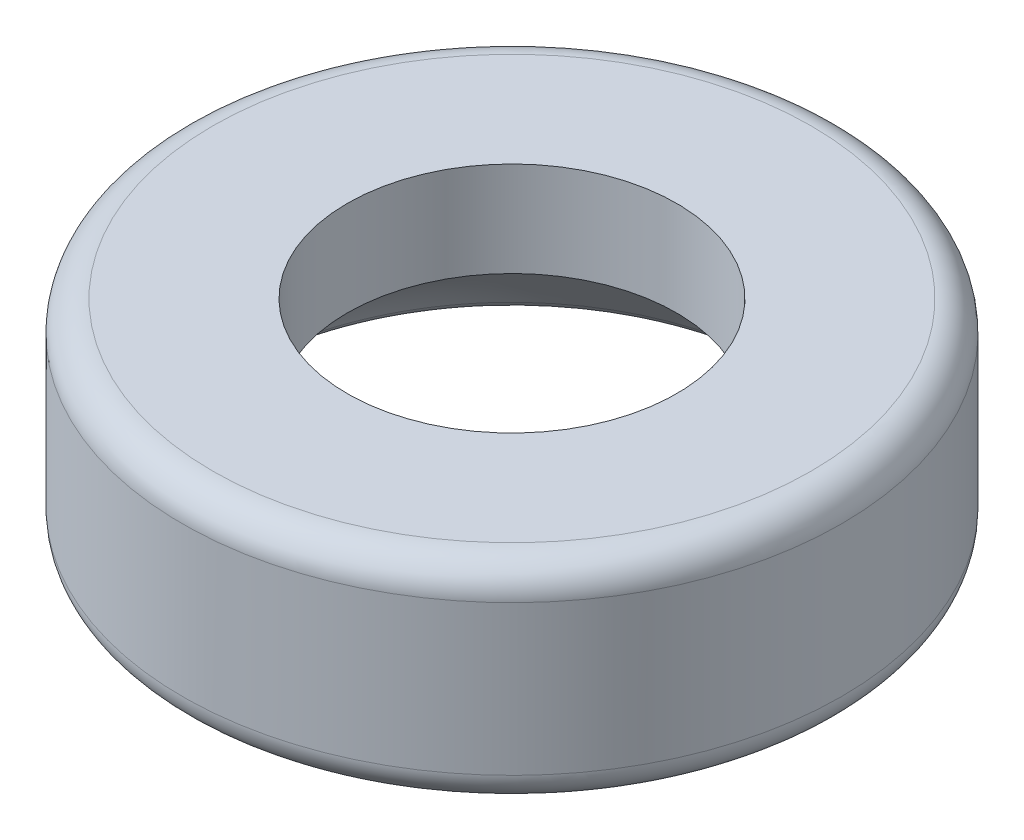
ISO-10303-21;
HEADER;
FILE_DESCRIPTION(('STEP AP214'),'2;1');
FILE_NAME('part.step','',(''),(''),'','','');
FILE_SCHEMA(('AUTOMOTIVE_DESIGN { 1 0 10303 214 1 1 1 1 }'));
ENDSEC;
DATA;
#1=APPLICATION_CONTEXT('core data for automotive mechanical design processes');
#2=APPLICATION_PROTOCOL_DEFINITION('international standard','automotive_design',2000,#1);
#3=PRODUCT_CONTEXT('',#1,'mechanical');
#4=PRODUCT('Part','Part','',(#3));
#5=PRODUCT_RELATED_PRODUCT_CATEGORY('part','',(#4));
#6=PRODUCT_DEFINITION_FORMATION('','',#4);
#7=PRODUCT_DEFINITION_CONTEXT('part definition',#1,'design');
#8=PRODUCT_DEFINITION('design','',#6,#7);
#9=PRODUCT_DEFINITION_SHAPE('','',#8);
#10=(LENGTH_UNIT() NAMED_UNIT(*) SI_UNIT(.MILLI.,.METRE.));
#11=(NAMED_UNIT(*) PLANE_ANGLE_UNIT() SI_UNIT($,.RADIAN.));
#12=(NAMED_UNIT(*) SI_UNIT($,.STERADIAN.) SOLID_ANGLE_UNIT());
#13=UNCERTAINTY_MEASURE_WITH_UNIT(LENGTH_MEASURE(1.E-05),#10,'distance_accuracy_value','');
#14=(GEOMETRIC_REPRESENTATION_CONTEXT(3) GLOBAL_UNCERTAINTY_ASSIGNED_CONTEXT((#13)) GLOBAL_UNIT_ASSIGNED_CONTEXT((#10,
#11,#12)) REPRESENTATION_CONTEXT('',''));
#15=CARTESIAN_POINT('',(0.,0.,0.));
#16=DIRECTION('',(0.,0.,1.));
#17=DIRECTION('',(1.,0.,0.));
#18=AXIS2_PLACEMENT_3D('',#15,#16,#17);
#19=CARTESIAN_POINT('',(0.,2.12704904258272,0.));
#20=DIRECTION('',(0.,1.,0.));
#21=DIRECTION('',(-1.,0.,0.));
#22=AXIS2_PLACEMENT_3D('',#19,#20,#21);
#23=CYLINDRICAL_SURFACE('',#22,2.06375);
#24=CARTESIAN_POINT('',(0.,4.76249999999999,0.));
#25=DIRECTION('',(0.,1.,0.));
#26=DIRECTION('',(-1.,0.,0.));
#27=AXIS2_PLACEMENT_3D('',#24,#25,#26);
#28=CIRCLE('',#27,2.06375);
#29=CARTESIAN_POINT('',(-2.06375000000002,4.76249999999999,0.));
#30=VERTEX_POINT('',#29);
#31=EDGE_CURVE('E18',#30,#30,#28,.F.);
#32=ORIENTED_EDGE('',*,*,#31,.F.);
#33=EDGE_LOOP('',(#32));
#34=FACE_BOUND('',#33,.T.);
#35=CARTESIAN_POINT('',(0.,3.57451985412042,0.));
#36=DIRECTION('',(0.,1.,0.));
#37=DIRECTION('',(-1.,0.,0.));
#38=AXIS2_PLACEMENT_3D('',#35,#36,#37);
#39=CIRCLE('',#38,2.06375);
#40=CARTESIAN_POINT('',(-2.06375000000001,3.57451985412041,0.));
#41=VERTEX_POINT('',#40);
#42=EDGE_CURVE('E65',#41,#41,#39,.F.);
#43=ORIENTED_EDGE('',*,*,#42,.T.);
#44=EDGE_LOOP('',(#43));
#45=FACE_BOUND('',#44,.T.);
#46=ADVANCED_FACE('F15',(#34,#45),#23,.F.);
#47=CARTESIAN_POINT('',(0.,4.76249999999999,0.));
#48=DIRECTION('',(0.,1.,0.));
#49=DIRECTION('',(-1.,0.,0.));
#50=AXIS2_PLACEMENT_3D('',#47,#48,#49);
#51=PLANE('',#50);
#52=CARTESIAN_POINT('',(0.,4.7625,0.));
#53=DIRECTION('',(0.,-1.,0.));
#54=DIRECTION('',(-1.,0.,0.));
#55=AXIS2_PLACEMENT_3D('',#52,#53,#54);
#56=CIRCLE('',#55,3.74650000000013);
#57=CARTESIAN_POINT('',(-3.74650000000015,4.76249999999998,0.));
#58=VERTEX_POINT('',#57);
#59=EDGE_CURVE('E64',#58,#58,#56,.T.);
#60=ORIENTED_EDGE('',*,*,#59,.F.);
#61=EDGE_LOOP('',(#60));
#62=FACE_BOUND('',#61,.T.);
#63=ORIENTED_EDGE('',*,*,#31,.T.);
#64=EDGE_LOOP('',(#63));
#65=FACE_BOUND('',#64,.T.);
#66=ADVANCED_FACE('F72',(#62,#65),#51,.T.);
#67=CARTESIAN_POINT('',(0.,0.,0.));
#68=DIRECTION('',(1.,0.,0.));
#69=DIRECTION('',(0.,1.,0.));
#70=AXIS2_PLACEMENT_3D('',#67,#68,#69);
#71=SPHERICAL_SURFACE('',#70,4.12750000000013);
#72=CARTESIAN_POINT('',(0.,2.2961012361673,0.));
#73=DIRECTION('',(0.,-1.,0.));
#74=DIRECTION('',(1.,0.,0.));
#75=AXIS2_PLACEMENT_3D('',#72,#73,#74);
#76=CIRCLE('',#75,3.42989436619731);
#77=CARTESIAN_POINT('',(3.42989436619731,2.29610123616731,0.));
#78=VERTEX_POINT('',#77);
#79=EDGE_CURVE('E27',#78,#78,#76,.F.);
#80=ORIENTED_EDGE('',*,*,#79,.F.);
#81=EDGE_LOOP('',(#80));
#82=FACE_BOUND('',#81,.T.);
#83=ORIENTED_EDGE('',*,*,#42,.F.);
#84=EDGE_LOOP('',(#83));
#85=FACE_BOUND('',#84,.T.);
#86=ADVANCED_FACE('F49',(#82,#85),#71,.F.);
#87=CARTESIAN_POINT('',(0.,4.3815,0.));
#88=DIRECTION('',(0.,1.,0.));
#89=DIRECTION('',(-1.,0.,0.));
#90=AXIS2_PLACEMENT_3D('',#87,#88,#89);
#91=TOROIDAL_SURFACE('',#90,3.74650000000013,0.381);
#92=CARTESIAN_POINT('',(0.,4.3815,0.));
#93=DIRECTION('',(0.,-1.,0.));
#94=DIRECTION('',(1.,0.,0.));
#95=AXIS2_PLACEMENT_3D('',#92,#93,#94);
#96=CIRCLE('',#95,4.12750000000013);
#97=CARTESIAN_POINT('',(4.12750000000012,4.38150000000001,0.));
#98=VERTEX_POINT('',#97);
#99=EDGE_CURVE('E22',#98,#98,#96,.T.);
#100=ORIENTED_EDGE('',*,*,#99,.F.);
#101=EDGE_LOOP('',(#100));
#102=FACE_BOUND('',#101,.T.);
#103=ORIENTED_EDGE('',*,*,#59,.T.);
#104=EDGE_LOOP('',(#103));
#105=FACE_BOUND('',#104,.T.);
#106=ADVANCED_FACE('F44',(#102,#105),#91,.T.);
#107=CARTESIAN_POINT('',(0.,2.50804904258273,0.));
#108=DIRECTION('',(0.,-1.,0.));
#109=DIRECTION('',(1.,0.,0.));
#110=AXIS2_PLACEMENT_3D('',#107,#108,#109);
#111=TOROIDAL_SURFACE('',#110,3.74650000000013,0.381);
#112=ORIENTED_EDGE('',*,*,#79,.T.);
#113=EDGE_LOOP('',(#112));
#114=FACE_BOUND('',#113,.T.);
#115=CARTESIAN_POINT('',(0.,2.50804904258273,0.));
#116=DIRECTION('',(0.,-1.,0.));
#117=DIRECTION('',(1.,0.,0.));
#118=AXIS2_PLACEMENT_3D('',#115,#116,#117);
#119=CIRCLE('',#118,4.12750000000013);
#120=CARTESIAN_POINT('',(4.12750000000012,2.50804904258275,0.));
#121=VERTEX_POINT('',#120);
#122=EDGE_CURVE('E10',#121,#121,#119,.F.);
#123=ORIENTED_EDGE('',*,*,#122,.F.);
#124=EDGE_LOOP('',(#123));
#125=FACE_BOUND('',#124,.T.);
#126=ADVANCED_FACE('F39',(#114,#125),#111,.T.);
#127=CARTESIAN_POINT('',(1.58731418455533E-13,-45.4624851319203,0.));
#128=DIRECTION('',(0.,-1.,0.));
#129=DIRECTION('',(1.,0.,0.));
#130=AXIS2_PLACEMENT_3D('',#127,#128,#129);
#131=CYLINDRICAL_SURFACE('',#130,4.12750000000013);
#132=ORIENTED_EDGE('',*,*,#122,.T.);
#133=EDGE_LOOP('',(#132));
#134=FACE_BOUND('',#133,.T.);
#135=ORIENTED_EDGE('',*,*,#99,.T.);
#136=EDGE_LOOP('',(#135));
#137=FACE_BOUND('',#136,.T.);
#138=ADVANCED_FACE('F43',(#134,#137),#131,.T.);
#139=CLOSED_SHELL('',(#46,#66,#86,#106,#126,#138));
#140=MANIFOLD_SOLID_BREP('B1',#139);
#141=ADVANCED_BREP_SHAPE_REPRESENTATION('',(#18,#140),#14);
#142=SHAPE_DEFINITION_REPRESENTATION(#9,#141);
ENDSEC;
END-ISO-10303-21;
